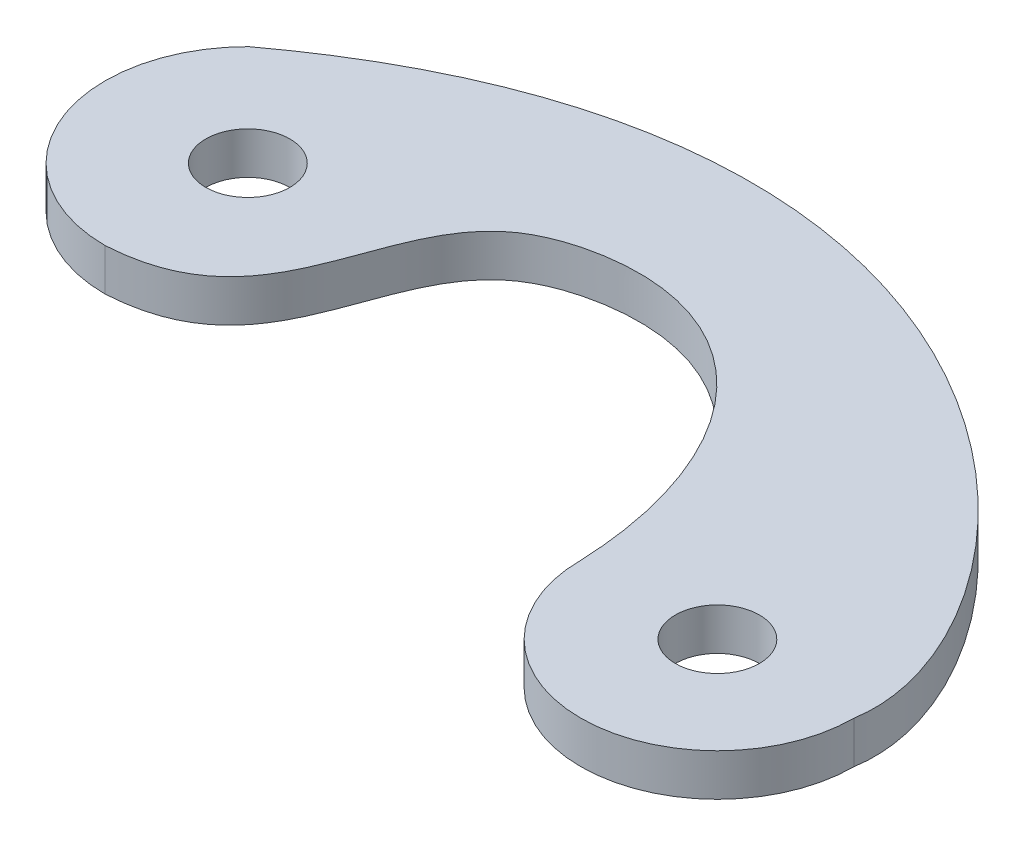
ISO-10303-21;
HEADER;
FILE_DESCRIPTION(('STEP AP214'),'2;1');
FILE_NAME('part.step','',(''),(''),'','','');
FILE_SCHEMA(('AUTOMOTIVE_DESIGN { 1 0 10303 214 1 1 1 1 }'));
ENDSEC;
DATA;
#1=APPLICATION_CONTEXT('core data for automotive mechanical design processes');
#2=APPLICATION_PROTOCOL_DEFINITION('international standard','automotive_design',2000,#1);
#3=PRODUCT_CONTEXT('',#1,'mechanical');
#4=PRODUCT('Part','Part','',(#3));
#5=PRODUCT_RELATED_PRODUCT_CATEGORY('part','',(#4));
#6=PRODUCT_DEFINITION_FORMATION('','',#4);
#7=PRODUCT_DEFINITION_CONTEXT('part definition',#1,'design');
#8=PRODUCT_DEFINITION('design','',#6,#7);
#9=PRODUCT_DEFINITION_SHAPE('','',#8);
#10=(LENGTH_UNIT() NAMED_UNIT(*) SI_UNIT(.MILLI.,.METRE.));
#11=(NAMED_UNIT(*) PLANE_ANGLE_UNIT() SI_UNIT($,.RADIAN.));
#12=(NAMED_UNIT(*) SI_UNIT($,.STERADIAN.) SOLID_ANGLE_UNIT());
#13=UNCERTAINTY_MEASURE_WITH_UNIT(LENGTH_MEASURE(1.E-05),#10,'distance_accuracy_value','');
#14=(GEOMETRIC_REPRESENTATION_CONTEXT(3) GLOBAL_UNCERTAINTY_ASSIGNED_CONTEXT((#13)) GLOBAL_UNIT_ASSIGNED_CONTEXT((#10,
#11,#12)) REPRESENTATION_CONTEXT('',''));
#15=CARTESIAN_POINT('',(0.,0.,0.));
#16=DIRECTION('',(0.,0.,1.));
#17=DIRECTION('',(1.,0.,0.));
#18=AXIS2_PLACEMENT_3D('',#15,#16,#17);
#19=CARTESIAN_POINT('',(61.3770953758634,2.,4.55443318973157));
#20=DIRECTION('',(0.,-1.,0.));
#21=DIRECTION('',(0.,0.,-1.));
#22=AXIS2_PLACEMENT_3D('',#19,#20,#21);
#23=PLANE('',#22);
#24=CARTESIAN_POINT('',(35.9830507734268,2.,12.3701488301119));
#25=DIRECTION('',(0.,1.,0.));
#26=DIRECTION('',(0.,0.,1.));
#27=AXIS2_PLACEMENT_3D('',#24,#25,#26);
#28=CIRCLE('',#27,2.);
#29=CARTESIAN_POINT('',(35.9830507734268,2.,14.3701488301119));
#30=VERTEX_POINT('',#29);
#31=EDGE_CURVE('E144',#30,#30,#28,.T.);
#32=ORIENTED_EDGE('',*,*,#31,.F.);
#33=EDGE_LOOP('',(#32));
#34=FACE_BOUND('',#33,.T.);
#35=CARTESIAN_POINT('',(73.2591708403629,2.,20.8131532619922));
#36=CARTESIAN_POINT('',(74.7258581680947,2.,12.215971782718));
#37=CARTESIAN_POINT('',(54.1260297711868,2.,-9.52585270634924));
#38=CARTESIAN_POINT('',(31.2019283487001,2.,7.55195502675404));
#39=B_SPLINE_CURVE_WITH_KNOTS('',3,(#35,#36,#37,#38),.UNSPECIFIED.,.F.,.F.,(4,4),(0.,1.),.UNSPECIFIED.);
#40=CARTESIAN_POINT('',(73.2591708403629,2.,20.8131532619922));
#41=VERTEX_POINT('',#40);
#42=CARTESIAN_POINT('',(31.2019283487002,2.,7.55195502675398));
#43=VERTEX_POINT('',#42);
#44=EDGE_CURVE('E86',#41,#43,#39,.T.);
#45=ORIENTED_EDGE('',*,*,#44,.T.);
#46=CARTESIAN_POINT('',(35.9830507734268,2.,12.3701488301119));
#47=DIRECTION('',(0.,1.,0.));
#48=DIRECTION('',(0.,0.,1.));
#49=AXIS2_PLACEMENT_3D('',#46,#47,#48);
#50=CIRCLE('',#49,6.78779221595217);
#51=CARTESIAN_POINT('',(35.9830507734268,2.,19.1579410460641));
#52=VERTEX_POINT('',#51);
#53=EDGE_CURVE('E81',#43,#52,#50,.T.);
#54=ORIENTED_EDGE('',*,*,#53,.T.);
#55=CARTESIAN_POINT('',(35.9830507734268,2.,19.1579410460641));
#56=CARTESIAN_POINT('',(43.2508327562247,2.,18.7354531416617));
#57=CARTESIAN_POINT('',(40.8487673175075,2.,9.67489741987843));
#58=CARTESIAN_POINT('',(54.4001875091586,2.,5.836538540276));
#59=CARTESIAN_POINT('',(59.9381973134697,2.,12.85038344081));
#60=CARTESIAN_POINT('',(60.2591708403629,2.,20.8131532619922));
#61=B_SPLINE_CURVE_WITH_KNOTS('',3,(#55,#56,#57,#58,#59,#60),.UNSPECIFIED.,.F.,.F.,(4,1,1,4),
(0.,0.397902878438823,0.497902878438823,1.),.UNSPECIFIED.);
#62=CARTESIAN_POINT('',(60.2591708403629,2.,20.8131532619922));
#63=VERTEX_POINT('',#62);
#64=EDGE_CURVE('E84',#52,#63,#61,.T.);
#65=ORIENTED_EDGE('',*,*,#64,.T.);
#66=CARTESIAN_POINT('',(66.7591708403629,2.,20.8131532619922));
#67=DIRECTION('',(0.,1.,0.));
#68=DIRECTION('',(0.,0.,1.));
#69=AXIS2_PLACEMENT_3D('',#66,#67,#68);
#70=CIRCLE('',#69,6.5);
#71=EDGE_CURVE('E51',#63,#41,#70,.T.);
#72=ORIENTED_EDGE('',*,*,#71,.T.);
#73=EDGE_LOOP('',(#45,#54,#65,#72));
#74=FACE_BOUND('',#73,.T.);
#75=CARTESIAN_POINT('',(66.7591708403629,2.,20.8131532619922));
#76=DIRECTION('',(0.,1.,0.));
#77=DIRECTION('',(0.,0.,1.));
#78=AXIS2_PLACEMENT_3D('',#75,#76,#77);
#79=CIRCLE('',#78,2.00000000002929);
#80=CARTESIAN_POINT('',(66.7591708403629,2.,22.8131532620214));
#81=VERTEX_POINT('',#80);
#82=EDGE_CURVE('E135',#81,#81,#79,.T.);
#83=ORIENTED_EDGE('',*,*,#82,.F.);
#84=EDGE_LOOP('',(#83));
#85=FACE_BOUND('',#84,.T.);
#86=ADVANCED_FACE('F33',(#34,#74,#85),#23,.F.);
#87=CARTESIAN_POINT('',(61.3770953758634,0.,4.55443318973157));
#88=DIRECTION('',(0.,-1.,0.));
#89=DIRECTION('',(0.,0.,-1.));
#90=AXIS2_PLACEMENT_3D('',#87,#88,#89);
#91=PLANE('',#90);
#92=CARTESIAN_POINT('',(35.9830507734268,0.,12.3701488301119));
#93=DIRECTION('',(0.,1.,0.));
#94=DIRECTION('',(0.,0.,1.));
#95=AXIS2_PLACEMENT_3D('',#92,#93,#94);
#96=CIRCLE('',#95,2.);
#97=CARTESIAN_POINT('',(35.9830507734268,0.,14.3701488301119));
#98=VERTEX_POINT('',#97);
#99=EDGE_CURVE('E141',#98,#98,#96,.T.);
#100=ORIENTED_EDGE('',*,*,#99,.T.);
#101=EDGE_LOOP('',(#100));
#102=FACE_BOUND('',#101,.T.);
#103=CARTESIAN_POINT('',(73.2591708403629,0.,20.8131532619922));
#104=CARTESIAN_POINT('',(74.7258581680947,0.,12.215971782718));
#105=CARTESIAN_POINT('',(54.1260297711868,0.,-9.52585270634924));
#106=CARTESIAN_POINT('',(31.2019283487001,0.,7.55195502675404));
#107=B_SPLINE_CURVE_WITH_KNOTS('',3,(#103,#104,#105,#106),.UNSPECIFIED.,.F.,.F.,(4,4),(0.,1.),.UNSPECIFIED.);
#108=CARTESIAN_POINT('',(73.2591708403629,0.,20.8131532619922));
#109=VERTEX_POINT('',#108);
#110=CARTESIAN_POINT('',(31.2019283487002,0.,7.55195502675398));
#111=VERTEX_POINT('',#110);
#112=EDGE_CURVE('E147',#109,#111,#107,.T.);
#113=ORIENTED_EDGE('',*,*,#112,.F.);
#114=CARTESIAN_POINT('',(66.7591708403629,0.,20.8131532619922));
#115=DIRECTION('',(0.,1.,0.));
#116=DIRECTION('',(0.,0.,1.));
#117=AXIS2_PLACEMENT_3D('',#114,#115,#116);
#118=CIRCLE('',#117,6.5);
#119=CARTESIAN_POINT('',(60.2591708403629,0.,20.8131532619922));
#120=VERTEX_POINT('',#119);
#121=EDGE_CURVE('E74',#120,#109,#118,.T.);
#122=ORIENTED_EDGE('',*,*,#121,.F.);
#123=CARTESIAN_POINT('',(35.9830507734268,0.,19.1579410460641));
#124=CARTESIAN_POINT('',(43.2508327562247,0.,18.7354531416617));
#125=CARTESIAN_POINT('',(40.8487673175075,0.,9.67489741987843));
#126=CARTESIAN_POINT('',(54.4001875091586,0.,5.836538540276));
#127=CARTESIAN_POINT('',(59.9381973134697,0.,12.85038344081));
#128=CARTESIAN_POINT('',(60.2591708403629,0.,20.8131532619922));
#129=B_SPLINE_CURVE_WITH_KNOTS('',3,(#123,#124,#125,#126,#127,#128),.UNSPECIFIED.,.F.,.F.,(4,1,
1,4),(0.,0.397902878438823,0.497902878438823,1.),.UNSPECIFIED.);
#130=CARTESIAN_POINT('',(35.9830507734268,0.,19.1579410460641));
#131=VERTEX_POINT('',#130);
#132=EDGE_CURVE('E68',#131,#120,#129,.T.);
#133=ORIENTED_EDGE('',*,*,#132,.F.);
#134=CARTESIAN_POINT('',(35.9830507734268,0.,12.3701488301119));
#135=DIRECTION('',(0.,1.,0.));
#136=DIRECTION('',(0.,0.,1.));
#137=AXIS2_PLACEMENT_3D('',#134,#135,#136);
#138=CIRCLE('',#137,6.78779221595217);
#139=EDGE_CURVE('E90',#111,#131,#138,.T.);
#140=ORIENTED_EDGE('',*,*,#139,.F.);
#141=EDGE_LOOP('',(#113,#122,#133,#140));
#142=FACE_BOUND('',#141,.T.);
#143=CARTESIAN_POINT('',(66.7591708403629,0.,20.8131532619922));
#144=DIRECTION('',(0.,1.,0.));
#145=DIRECTION('',(0.,0.,1.));
#146=AXIS2_PLACEMENT_3D('',#143,#144,#145);
#147=CIRCLE('',#146,2.00000000002929);
#148=CARTESIAN_POINT('',(66.7591708403629,0.,22.8131532620214));
#149=VERTEX_POINT('',#148);
#150=EDGE_CURVE('E138',#149,#149,#147,.T.);
#151=ORIENTED_EDGE('',*,*,#150,.T.);
#152=EDGE_LOOP('',(#151));
#153=FACE_BOUND('',#152,.T.);
#154=ADVANCED_FACE('F112',(#102,#142,#153),#91,.T.);
#155=DIRECTION('',(0.,-1.,0.));
#156=VECTOR('',#155,1.);
#157=SURFACE_OF_LINEAR_EXTRUSION('',#39,#156);
#158=ORIENTED_EDGE('',*,*,#112,.T.);
#159=DIRECTION('',(0.,-1.,0.));
#160=VECTOR('',#159,1.);
#161=CARTESIAN_POINT('',(31.2019283487002,2.,7.55195502675398));
#162=LINE('',#161,#160);
#163=EDGE_CURVE('E11',#43,#111,#162,.T.);
#164=ORIENTED_EDGE('',*,*,#163,.F.);
#165=ORIENTED_EDGE('',*,*,#44,.F.);
#166=DIRECTION('',(0.,-1.,0.));
#167=VECTOR('',#166,1.);
#168=CARTESIAN_POINT('',(73.2591708403629,2.,20.8131532619922));
#169=LINE('',#168,#167);
#170=EDGE_CURVE('E94',#41,#109,#169,.T.);
#171=ORIENTED_EDGE('',*,*,#170,.T.);
#172=EDGE_LOOP('',(#158,#164,#165,#171));
#173=FACE_BOUND('',#172,.T.);
#174=ADVANCED_FACE('F35',(#173),#157,.F.);
#175=CARTESIAN_POINT('',(35.9830507734268,2.,12.3701488301119));
#176=DIRECTION('',(0.,-1.,0.));
#177=DIRECTION('',(0.,0.,-1.));
#178=AXIS2_PLACEMENT_3D('',#175,#176,#177);
#179=CYLINDRICAL_SURFACE('',#178,6.78779221595217);
#180=ORIENTED_EDGE('',*,*,#139,.T.);
#181=DIRECTION('',(0.,-1.,0.));
#182=VECTOR('',#181,1.);
#183=CARTESIAN_POINT('',(35.9830507734268,2.,19.1579410460641));
#184=LINE('',#183,#182);
#185=EDGE_CURVE('E43',#52,#131,#184,.T.);
#186=ORIENTED_EDGE('',*,*,#185,.F.);
#187=ORIENTED_EDGE('',*,*,#53,.F.);
#188=ORIENTED_EDGE('',*,*,#163,.T.);
#189=EDGE_LOOP('',(#180,#186,#187,#188));
#190=FACE_BOUND('',#189,.T.);
#191=ADVANCED_FACE('F89',(#190),#179,.T.);
#192=DIRECTION('',(0.,-1.,0.));
#193=VECTOR('',#192,1.);
#194=SURFACE_OF_LINEAR_EXTRUSION('',#61,#193);
#195=ORIENTED_EDGE('',*,*,#132,.T.);
#196=DIRECTION('',(0.,-1.,0.));
#197=VECTOR('',#196,1.);
#198=CARTESIAN_POINT('',(60.2591708403629,2.,20.8131532619922));
#199=LINE('',#198,#197);
#200=EDGE_CURVE('E91',#63,#120,#199,.T.);
#201=ORIENTED_EDGE('',*,*,#200,.F.);
#202=ORIENTED_EDGE('',*,*,#64,.F.);
#203=ORIENTED_EDGE('',*,*,#185,.T.);
#204=EDGE_LOOP('',(#195,#201,#202,#203));
#205=FACE_BOUND('',#204,.T.);
#206=ADVANCED_FACE('F92',(#205),#194,.F.);
#207=CARTESIAN_POINT('',(66.7591708403629,2.,20.8131532619922));
#208=DIRECTION('',(0.,-1.,0.));
#209=DIRECTION('',(0.,0.,-1.));
#210=AXIS2_PLACEMENT_3D('',#207,#208,#209);
#211=CYLINDRICAL_SURFACE('',#210,6.5);
#212=ORIENTED_EDGE('',*,*,#121,.T.);
#213=ORIENTED_EDGE('',*,*,#170,.F.);
#214=ORIENTED_EDGE('',*,*,#71,.F.);
#215=ORIENTED_EDGE('',*,*,#200,.T.);
#216=EDGE_LOOP('',(#212,#213,#214,#215));
#217=FACE_BOUND('',#216,.T.);
#218=ADVANCED_FACE('F106',(#217),#211,.T.);
#219=CARTESIAN_POINT('',(35.9830507734268,2.,12.3701488301119));
#220=DIRECTION('',(0.,-1.,0.));
#221=DIRECTION('',(0.,0.,-1.));
#222=AXIS2_PLACEMENT_3D('',#219,#220,#221);
#223=CYLINDRICAL_SURFACE('',#222,2.);
#224=ORIENTED_EDGE('',*,*,#31,.T.);
#225=EDGE_LOOP('',(#224));
#226=FACE_BOUND('',#225,.T.);
#227=ORIENTED_EDGE('',*,*,#99,.F.);
#228=EDGE_LOOP('',(#227));
#229=FACE_BOUND('',#228,.T.);
#230=ADVANCED_FACE('F123',(#226,#229),#223,.F.);
#231=CARTESIAN_POINT('',(66.7591708403629,2.,20.8131532619922));
#232=DIRECTION('',(0.,-1.,0.));
#233=DIRECTION('',(0.,0.,-1.));
#234=AXIS2_PLACEMENT_3D('',#231,#232,#233);
#235=CYLINDRICAL_SURFACE('',#234,2.00000000002929);
#236=ORIENTED_EDGE('',*,*,#82,.T.);
#237=EDGE_LOOP('',(#236));
#238=FACE_BOUND('',#237,.T.);
#239=ORIENTED_EDGE('',*,*,#150,.F.);
#240=EDGE_LOOP('',(#239));
#241=FACE_BOUND('',#240,.T.);
#242=ADVANCED_FACE('F126',(#238,#241),#235,.F.);
#243=CLOSED_SHELL('',(#86,#154,#174,#191,#206,#218,#230,#242));
#244=MANIFOLD_SOLID_BREP('B2',#243);
#245=ADVANCED_BREP_SHAPE_REPRESENTATION('',(#18,#244),#14);
#246=SHAPE_DEFINITION_REPRESENTATION(#9,#245);
ENDSEC;
END-ISO-10303-21;
